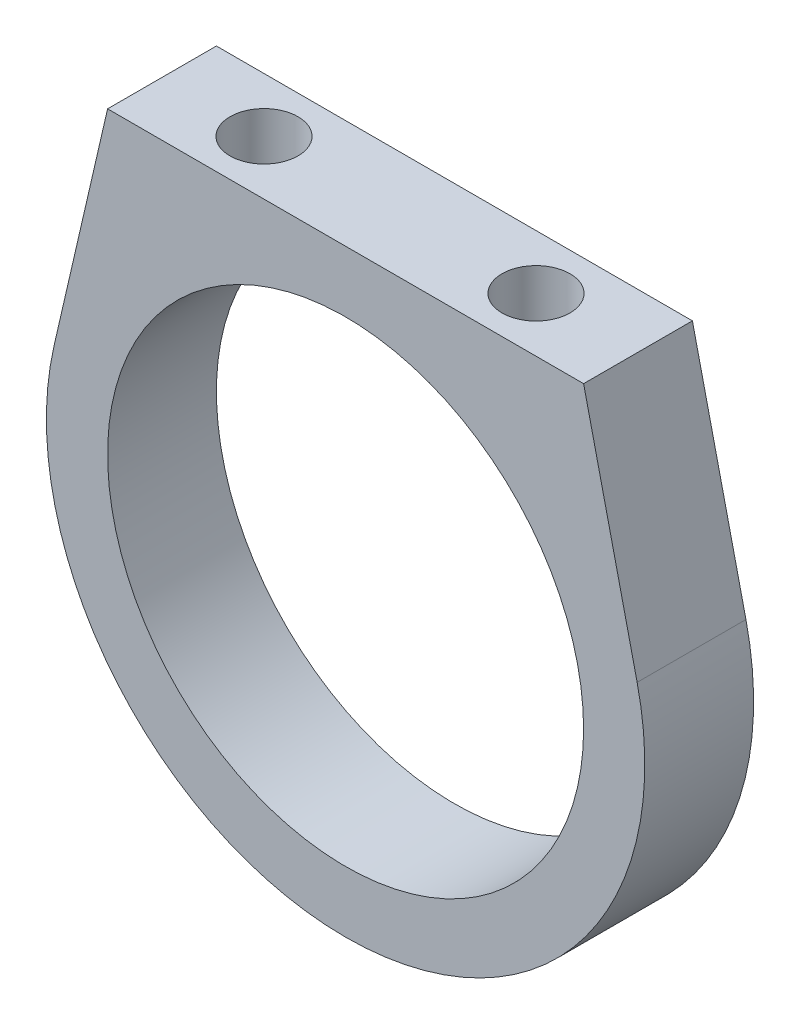
ISO-10303-21;
HEADER;
FILE_DESCRIPTION(('STEP AP214'),'2;1');
FILE_NAME('part.step','',(''),(''),'','','');
FILE_SCHEMA(('AUTOMOTIVE_DESIGN { 1 0 10303 214 1 1 1 1 }'));
ENDSEC;
DATA;
#1=APPLICATION_CONTEXT('core data for automotive mechanical design processes');
#2=APPLICATION_PROTOCOL_DEFINITION('international standard','automotive_design',2000,#1);
#3=PRODUCT_CONTEXT('',#1,'mechanical');
#4=PRODUCT('Part','Part','',(#3));
#5=PRODUCT_RELATED_PRODUCT_CATEGORY('part','',(#4));
#6=PRODUCT_DEFINITION_FORMATION('','',#4);
#7=PRODUCT_DEFINITION_CONTEXT('part definition',#1,'design');
#8=PRODUCT_DEFINITION('design','',#6,#7);
#9=PRODUCT_DEFINITION_SHAPE('','',#8);
#10=(LENGTH_UNIT() NAMED_UNIT(*) SI_UNIT(.MILLI.,.METRE.));
#11=(NAMED_UNIT(*) PLANE_ANGLE_UNIT() SI_UNIT($,.RADIAN.));
#12=(NAMED_UNIT(*) SI_UNIT($,.STERADIAN.) SOLID_ANGLE_UNIT());
#13=UNCERTAINTY_MEASURE_WITH_UNIT(LENGTH_MEASURE(1.E-05),#10,'distance_accuracy_value','');
#14=(GEOMETRIC_REPRESENTATION_CONTEXT(3) GLOBAL_UNCERTAINTY_ASSIGNED_CONTEXT((#13)) GLOBAL_UNIT_ASSIGNED_CONTEXT((#10,
#11,#12)) REPRESENTATION_CONTEXT('',''));
#15=CARTESIAN_POINT('',(0.,0.,0.));
#16=DIRECTION('',(0.,0.,1.));
#17=DIRECTION('',(1.,0.,0.));
#18=AXIS2_PLACEMENT_3D('',#15,#16,#17);
#19=CARTESIAN_POINT('',(0.,0.,2.));
#20=DIRECTION('',(0.,0.,-1.));
#21=DIRECTION('',(-1.,0.,0.));
#22=AXIS2_PLACEMENT_3D('',#19,#20,#21);
#23=PLANE('',#22);
#24=DIRECTION('',(-0.224928819993672,0.97437519772224,0.));
#25=VECTOR('',#24,1.);
#26=CARTESIAN_POINT('',(8.75,11.,2.));
#27=LINE('',#26,#25);
#28=CARTESIAN_POINT('',(10.7181271749446,2.4742170199304,2.));
#29=VERTEX_POINT('',#28);
#30=CARTESIAN_POINT('',(8.75,11.,2.));
#31=VERTEX_POINT('',#30);
#32=EDGE_CURVE('E92',#29,#31,#27,.T.);
#33=ORIENTED_EDGE('',*,*,#32,.T.);
#34=DIRECTION('',(-1.,0.,0.));
#35=VECTOR('',#34,1.);
#36=CARTESIAN_POINT('',(8.75,11.,2.));
#37=LINE('',#36,#35);
#38=CARTESIAN_POINT('',(-8.75,11.,2.));
#39=VERTEX_POINT('',#38);
#40=EDGE_CURVE('E87',#31,#39,#37,.T.);
#41=ORIENTED_EDGE('',*,*,#40,.T.);
#42=DIRECTION('',(-0.224928819993673,-0.97437519772224,0.));
#43=VECTOR('',#42,1.);
#44=CARTESIAN_POINT('',(-8.75,11.,2.));
#45=LINE('',#44,#43);
#46=CARTESIAN_POINT('',(-10.7181271749446,2.4742170199304,2.));
#47=VERTEX_POINT('',#46);
#48=EDGE_CURVE('E90',#39,#47,#45,.T.);
#49=ORIENTED_EDGE('',*,*,#48,.T.);
#50=CARTESIAN_POINT('',(0.,0.,2.));
#51=DIRECTION('',(0.,0.,1.));
#52=DIRECTION('',(-1.,0.,0.));
#53=AXIS2_PLACEMENT_3D('',#50,#51,#52);
#54=CIRCLE('',#53,11.);
#55=EDGE_CURVE('E57',#47,#29,#54,.T.);
#56=ORIENTED_EDGE('',*,*,#55,.T.);
#57=EDGE_LOOP('',(#33,#41,#49,#56));
#58=FACE_BOUND('',#57,.T.);
#59=CARTESIAN_POINT('',(0.,0.,2.));
#60=DIRECTION('',(0.,0.,1.));
#61=DIRECTION('',(1.,0.,0.));
#62=AXIS2_PLACEMENT_3D('',#59,#60,#61);
#63=CIRCLE('',#62,8.75);
#64=CARTESIAN_POINT('',(8.75,0.,2.));
#65=VERTEX_POINT('',#64);
#66=EDGE_CURVE('E112',#65,#65,#63,.T.);
#67=ORIENTED_EDGE('',*,*,#66,.F.);
#68=EDGE_LOOP('',(#67));
#69=FACE_BOUND('',#68,.T.);
#70=ADVANCED_FACE('F39',(#58,#69),#23,.F.);
#71=CARTESIAN_POINT('',(0.,0.,-2.));
#72=DIRECTION('',(0.,0.,-1.));
#73=DIRECTION('',(-1.,0.,0.));
#74=AXIS2_PLACEMENT_3D('',#71,#72,#73);
#75=PLANE('',#74);
#76=DIRECTION('',(-0.224928819993672,0.97437519772224,0.));
#77=VECTOR('',#76,1.);
#78=CARTESIAN_POINT('',(8.75,11.,-2.));
#79=LINE('',#78,#77);
#80=CARTESIAN_POINT('',(10.7181271749446,2.4742170199304,-2.));
#81=VERTEX_POINT('',#80);
#82=CARTESIAN_POINT('',(8.75,11.,-2.));
#83=VERTEX_POINT('',#82);
#84=EDGE_CURVE('E108',#81,#83,#79,.T.);
#85=ORIENTED_EDGE('',*,*,#84,.F.);
#86=CARTESIAN_POINT('',(0.,0.,-2.));
#87=DIRECTION('',(0.,0.,1.));
#88=DIRECTION('',(-1.,0.,0.));
#89=AXIS2_PLACEMENT_3D('',#86,#87,#88);
#90=CIRCLE('',#89,11.);
#91=CARTESIAN_POINT('',(-10.7181271749446,2.4742170199304,-2.));
#92=VERTEX_POINT('',#91);
#93=EDGE_CURVE('E80',#92,#81,#90,.T.);
#94=ORIENTED_EDGE('',*,*,#93,.F.);
#95=DIRECTION('',(-0.224928819993673,-0.97437519772224,0.));
#96=VECTOR('',#95,1.);
#97=CARTESIAN_POINT('',(-8.75,11.,-2.));
#98=LINE('',#97,#96);
#99=CARTESIAN_POINT('',(-8.75,11.,-2.));
#100=VERTEX_POINT('',#99);
#101=EDGE_CURVE('E74',#100,#92,#98,.T.);
#102=ORIENTED_EDGE('',*,*,#101,.F.);
#103=DIRECTION('',(-1.,0.,0.));
#104=VECTOR('',#103,1.);
#105=CARTESIAN_POINT('',(8.75,11.,-2.));
#106=LINE('',#105,#104);
#107=EDGE_CURVE('E97',#83,#100,#106,.T.);
#108=ORIENTED_EDGE('',*,*,#107,.F.);
#109=EDGE_LOOP('',(#85,#94,#102,#108));
#110=FACE_BOUND('',#109,.T.);
#111=CARTESIAN_POINT('',(0.,0.,-2.));
#112=DIRECTION('',(0.,0.,1.));
#113=DIRECTION('',(1.,0.,0.));
#114=AXIS2_PLACEMENT_3D('',#111,#112,#113);
#115=CIRCLE('',#114,8.75);
#116=CARTESIAN_POINT('',(8.75,0.,-2.));
#117=VERTEX_POINT('',#116);
#118=EDGE_CURVE('E130',#117,#117,#115,.T.);
#119=ORIENTED_EDGE('',*,*,#118,.T.);
#120=EDGE_LOOP('',(#119));
#121=FACE_BOUND('',#120,.T.);
#122=ADVANCED_FACE('F125',(#110,#121),#75,.T.);
#123=CARTESIAN_POINT('',(8.75,11.,2.));
#124=DIRECTION('',(-0.97437519772224,-0.224928819993673,0.));
#125=DIRECTION('',(0.224928819993673,-0.97437519772224,0.));
#126=AXIS2_PLACEMENT_3D('',#123,#124,#125);
#127=PLANE('',#126);
#128=ORIENTED_EDGE('',*,*,#84,.T.);
#129=DIRECTION('',(0.,0.,-1.));
#130=VECTOR('',#129,1.);
#131=CARTESIAN_POINT('',(8.75,11.,2.));
#132=LINE('',#131,#130);
#133=EDGE_CURVE('E11',#31,#83,#132,.T.);
#134=ORIENTED_EDGE('',*,*,#133,.F.);
#135=ORIENTED_EDGE('',*,*,#32,.F.);
#136=DIRECTION('',(0.,0.,-1.));
#137=VECTOR('',#136,1.);
#138=CARTESIAN_POINT('',(10.7181271749446,2.4742170199304,2.));
#139=LINE('',#138,#137);
#140=EDGE_CURVE('E104',#29,#81,#139,.T.);
#141=ORIENTED_EDGE('',*,*,#140,.T.);
#142=EDGE_LOOP('',(#128,#134,#135,#141));
#143=FACE_BOUND('',#142,.T.);
#144=ADVANCED_FACE('F41',(#143),#127,.F.);
#145=CARTESIAN_POINT('',(8.75,11.,2.));
#146=DIRECTION('',(0.,-1.,0.));
#147=DIRECTION('',(1.,0.,0.));
#148=AXIS2_PLACEMENT_3D('',#145,#146,#147);
#149=PLANE('',#148);
#150=CARTESIAN_POINT('',(-5.,11.,0.));
#151=DIRECTION('',(0.,1.,0.));
#152=DIRECTION('',(-1.,0.,0.));
#153=AXIS2_PLACEMENT_3D('',#150,#151,#152);
#154=CIRCLE('',#153,1.25);
#155=CARTESIAN_POINT('',(-6.25,11.,0.));
#156=VERTEX_POINT('',#155);
#157=EDGE_CURVE('E147',#156,#156,#154,.T.);
#158=ORIENTED_EDGE('',*,*,#157,.F.);
#159=EDGE_LOOP('',(#158));
#160=FACE_BOUND('',#159,.T.);
#161=CARTESIAN_POINT('',(5.,11.,0.));
#162=DIRECTION('',(0.,1.,0.));
#163=DIRECTION('',(-1.,0.,0.));
#164=AXIS2_PLACEMENT_3D('',#161,#162,#163);
#165=CIRCLE('',#164,1.25);
#166=CARTESIAN_POINT('',(3.75,11.,0.));
#167=VERTEX_POINT('',#166);
#168=EDGE_CURVE('E148',#167,#167,#165,.T.);
#169=ORIENTED_EDGE('',*,*,#168,.F.);
#170=EDGE_LOOP('',(#169));
#171=FACE_BOUND('',#170,.T.);
#172=ORIENTED_EDGE('',*,*,#107,.T.);
#173=DIRECTION('',(0.,0.,-1.));
#174=VECTOR('',#173,1.);
#175=CARTESIAN_POINT('',(-8.75,11.,2.));
#176=LINE('',#175,#174);
#177=EDGE_CURVE('E49',#39,#100,#176,.T.);
#178=ORIENTED_EDGE('',*,*,#177,.F.);
#179=ORIENTED_EDGE('',*,*,#40,.F.);
#180=ORIENTED_EDGE('',*,*,#133,.T.);
#181=EDGE_LOOP('',(#172,#178,#179,#180));
#182=FACE_BOUND('',#181,.T.);
#183=ADVANCED_FACE('F96',(#160,#171,#182),#149,.F.);
#184=CARTESIAN_POINT('',(-8.75,11.,2.));
#185=DIRECTION('',(0.97437519772224,-0.224928819993673,0.));
#186=DIRECTION('',(0.224928819993673,0.97437519772224,0.));
#187=AXIS2_PLACEMENT_3D('',#184,#185,#186);
#188=PLANE('',#187);
#189=ORIENTED_EDGE('',*,*,#101,.T.);
#190=DIRECTION('',(0.,0.,-1.));
#191=VECTOR('',#190,1.);
#192=CARTESIAN_POINT('',(-10.7181271749446,2.4742170199304,2.));
#193=LINE('',#192,#191);
#194=EDGE_CURVE('E99',#47,#92,#193,.T.);
#195=ORIENTED_EDGE('',*,*,#194,.F.);
#196=ORIENTED_EDGE('',*,*,#48,.F.);
#197=ORIENTED_EDGE('',*,*,#177,.T.);
#198=EDGE_LOOP('',(#189,#195,#196,#197));
#199=FACE_BOUND('',#198,.T.);
#200=ADVANCED_FACE('F100',(#199),#188,.F.);
#201=CARTESIAN_POINT('',(0.,0.,2.));
#202=DIRECTION('',(0.,0.,-1.));
#203=DIRECTION('',(-1.,0.,0.));
#204=AXIS2_PLACEMENT_3D('',#201,#202,#203);
#205=CYLINDRICAL_SURFACE('',#204,11.);
#206=ORIENTED_EDGE('',*,*,#93,.T.);
#207=ORIENTED_EDGE('',*,*,#140,.F.);
#208=ORIENTED_EDGE('',*,*,#55,.F.);
#209=ORIENTED_EDGE('',*,*,#194,.T.);
#210=EDGE_LOOP('',(#206,#207,#208,#209));
#211=FACE_BOUND('',#210,.T.);
#212=ADVANCED_FACE('F122',(#211),#205,.T.);
#213=CARTESIAN_POINT('',(0.,0.,2.));
#214=DIRECTION('',(0.,0.,-1.));
#215=DIRECTION('',(-1.,0.,0.));
#216=AXIS2_PLACEMENT_3D('',#213,#214,#215);
#217=CYLINDRICAL_SURFACE('',#216,8.75);
#218=CARTESIAN_POINT('',(-6.25,6.12372435695795,0.));
#219=CARTESIAN_POINT('',(-6.249999096093,6.12372546096745,0.0563594232897364));
#220=CARTESIAN_POINT('',(-6.24615625776132,6.1276547519167,0.112724438972845));
#221=CARTESIAN_POINT('',(-6.23113950883662,6.14292348801361,0.223438761348298));
#222=CARTESIAN_POINT('',(-6.2199592866147,6.15426931284174,0.277786290031283));
#223=CARTESIAN_POINT('',(-6.19126807045086,6.18313056019453,0.38250360300182));
#224=CARTESIAN_POINT('',(-6.17380767488917,6.20059664453786,0.432901365713372));
#225=CARTESIAN_POINT('',(-6.13355890106298,6.240413281092,0.529418482378272));
#226=CARTESIAN_POINT('',(-6.11076761360915,6.26276649988724,0.575535480956767));
#227=CARTESIAN_POINT('',(-6.04935167888696,6.32221415201453,0.683200160578885));
#228=CARTESIAN_POINT('',(-6.00824733013812,6.36138119379406,0.742188500421584));
#229=CARTESIAN_POINT('',(-5.91882511757456,6.44466983438752,0.850416866381751));
#230=CARTESIAN_POINT('',(-5.87049099603652,6.48880254269753,0.899634324644743));
#231=CARTESIAN_POINT('',(-5.75383662607383,6.59268663294137,1.00086969809913));
#232=CARTESIAN_POINT('',(-5.68369978584556,6.65336395471925,1.04984784895274));
#233=CARTESIAN_POINT('',(-5.53630902033819,6.77650582893226,1.13225629933346));
#234=CARTESIAN_POINT('',(-5.45905275709437,6.83897096379569,1.16568146942431));
#235=CARTESIAN_POINT('',(-5.2985775081916,6.96405013744927,1.21675356540498));
#236=CARTESIAN_POINT('',(-5.21531802976826,7.02666175995002,1.23427987419735));
#237=CARTESIAN_POINT('',(-5.04532512827686,7.14969891482871,1.25209603132461));
#238=CARTESIAN_POINT('',(-4.95859126934844,7.21012417110632,1.25238371025771));
#239=CARTESIAN_POINT('',(-4.78407675449362,7.32708394447044,1.23433707940384));
#240=CARTESIAN_POINT('',(-4.69629431613965,7.3836102256591,1.21596456657741));
#241=CARTESIAN_POINT('',(-4.52360067328527,7.49064728832806,1.15920623340716));
#242=CARTESIAN_POINT('',(-4.43868379749746,7.54117051963099,1.12086275346982));
#243=CARTESIAN_POINT('',(-4.30018189665139,7.62072007841812,1.03790710304831));
#244=CARTESIAN_POINT('',(-4.24466992870429,7.65172374345529,0.998365737639541));
#245=CARTESIAN_POINT('',(-4.13953717904732,7.70910537438197,0.90930649332825));
#246=CARTESIAN_POINT('',(-4.08991311700303,7.73548591989956,0.859794211401929));
#247=CARTESIAN_POINT('',(-3.99849308608598,7.78313790056994,0.751357326611252));
#248=CARTESIAN_POINT('',(-3.95673751743854,7.80438311829188,0.692386879427451));
#249=CARTESIAN_POINT('',(-3.88349497458128,7.84108761666943,0.566741516443978));
#250=CARTESIAN_POINT('',(-3.85200453177265,7.85654885200112,0.500069213446045));
#251=CARTESIAN_POINT('',(-3.80340741426022,7.88018124361184,0.367659291123228));
#252=CARTESIAN_POINT('',(-3.78523871210782,7.88889494358625,0.302406970596992));
#253=CARTESIAN_POINT('',(-3.75967743920744,7.90110949847954,0.169359179317205));
#254=CARTESIAN_POINT('',(-3.75228048670892,7.90461247303856,0.101564754163285));
#255=CARTESIAN_POINT('',(-3.74872517275212,7.90629877386604,-0.0305619194684281));
#256=CARTESIAN_POINT('',(-3.75195995121551,7.90476934445697,-0.094875170100253));
#257=CARTESIAN_POINT('',(-3.76819829012655,7.89704131252007,-0.221960516608587));
#258=CARTESIAN_POINT('',(-3.78120062463735,7.89084329595157,-0.284732804872046));
#259=CARTESIAN_POINT('',(-3.81628757543711,7.87393304627919,-0.406597214599854));
#260=CARTESIAN_POINT('',(-3.83831449081365,7.86324948208753,-0.465710019205968));
#261=CARTESIAN_POINT('',(-3.89052181118568,7.83754952383312,-0.579189716286421));
#262=CARTESIAN_POINT('',(-3.92070302837798,7.82253269815233,-0.633556135290151));
#263=CARTESIAN_POINT('',(-3.98931067867307,7.78777430605972,-0.738290308669741));
#264=CARTESIAN_POINT('',(-4.02800532699622,7.76787579959446,-0.788429680770055));
#265=CARTESIAN_POINT('',(-4.11141969746881,7.72404984811058,-0.881378919850113));
#266=CARTESIAN_POINT('',(-4.15614104306459,7.7001213170656,-0.924186804824307));
#267=CARTESIAN_POINT('',(-4.25395565342631,7.64654905937143,-1.00512197218277));
#268=CARTESIAN_POINT('',(-4.30743470910924,7.61659758234492,-1.04257760637017));
#269=CARTESIAN_POINT('',(-4.41788338739642,7.55307031514492,-1.10804696578221));
#270=CARTESIAN_POINT('',(-4.47485454094057,7.519492930384,-1.13605651433574));
#271=CARTESIAN_POINT('',(-4.59795219269701,7.44493980225258,-1.18566121300808));
#272=CARTESIAN_POINT('',(-4.66433362554407,7.40356377586208,-1.20601873825618));
#273=CARTESIAN_POINT('',(-4.79767220828918,7.31786433469221,-1.23540754246909));
#274=CARTESIAN_POINT('',(-4.86462961237544,7.27353955360786,-1.24443353193435));
#275=CARTESIAN_POINT('',(-5.0078117823398,7.17585653205728,-1.25233067311611));
#276=CARTESIAN_POINT('',(-5.08389610678853,7.12215012592676,-1.24944731648408));
#277=CARTESIAN_POINT('',(-5.23324776986433,7.01314407934382,-1.23035505007691));
#278=CARTESIAN_POINT('',(-5.30651225253695,6.95784291795123,-1.21413298418881));
#279=CARTESIAN_POINT('',(-5.4583345855297,6.83955590344397,-1.16601610076994));
#280=CARTESIAN_POINT('',(-5.53629412502829,6.77652935675438,-1.13231869093175));
#281=CARTESIAN_POINT('',(-5.68494946342322,6.65230872931585,-1.04909463472657));
#282=CARTESIAN_POINT('',(-5.75564781102282,6.59111401096962,-0.999573567782085));
#283=CARTESIAN_POINT('',(-5.87141138313349,6.48795106234658,-0.898618656743276));
#284=CARTESIAN_POINT('',(-5.91852295269155,6.44493370615744,-0.8505969918606));
#285=CARTESIAN_POINT('',(-6.00588530700094,6.36359812773176,-0.745226587313482));
#286=CARTESIAN_POINT('',(-6.04614803625173,6.32527175777461,-0.687894433968867));
#287=CARTESIAN_POINT('',(-6.10899061252573,6.26451567140223,-0.579263693283493));
#288=CARTESIAN_POINT('',(-6.13348228644272,6.24049698573919,-0.529967078675721));
#289=CARTESIAN_POINT('',(-6.17632079276237,6.19810213751813,-0.426489798287949));
#290=CARTESIAN_POINT('',(-6.19467459345415,6.17971957828762,-0.372314760288681));
#291=CARTESIAN_POINT('',(-6.22255056955986,6.1516437828712,-0.265694989849344));
#292=CARTESIAN_POINT('',(-6.23277145574091,6.14126632753066,-0.213617367915958));
#293=CARTESIAN_POINT('',(-6.24649435745652,6.12730835856435,-0.107694061635097));
#294=CARTESIAN_POINT('',(-6.25000086365354,6.12372330211302,-0.0538495835149319));
#295=CARTESIAN_POINT('',(-6.25,6.12372435695795,0.));
#296=B_SPLINE_CURVE_WITH_KNOTS('',3,(#218,#219,#220,#221,#222,#223,#224,#225,#226,#227,#228,
#229,#230,#231,#232,#233,#234,#235,#236,#237,#238,#239,#240,#241,#242,#243,#244,#245,#246,#247,
#248,#249,#250,#251,#252,#253,#254,#255,#256,#257,#258,#259,#260,#261,#262,#263,#264,#265,#266,
#267,#268,#269,#270,#271,#272,#273,#274,#275,#276,#277,#278,#279,#280,#281,#282,#283,#284,#285,
#286,#287,#288,#289,#290,#291,#292,#293,#294,#295),.UNSPECIFIED.,.T.,.F.,(4,2,2,2,2,2,2,2,2,2,2,
2,2,2,2,2,2,2,2,2,2,2,2,2,2,2,2,2,2,2,2,2,2,2,2,2,2,2,4),(0.,0.168836841294259,
0.337819106995227,0.505469333568072,0.673211265039158,0.917483490871702,1.16231351215936,
1.47535131733696,1.7884922906063,2.10398951677298,2.41952644672235,2.73571068067113,
3.05122728539251,3.27493240050976,3.49851229147229,3.72321059643704,3.9478328966709,
4.15165219023416,4.35538855065847,4.54770205632058,4.739991428532,4.93107007492327,
5.12216776043286,5.32047837280405,5.51884251243527,5.73347248720492,5.94819723849085,
6.18973338168172,6.43138223076559,6.70980734594098,6.98850740468303,7.30439902288818,
7.62017938037068,7.85894354021995,8.09728692410481,8.27681849191477,8.45614554118431,
8.61757161619797,8.77888968964476),.UNSPECIFIED.);
#297=CARTESIAN_POINT('',(-6.25,6.12372435695795,0.));
#298=VERTEX_POINT('',#297);
#299=EDGE_CURVE('E134',#298,#298,#296,.T.);
#300=ORIENTED_EDGE('',*,*,#299,.T.);
#301=EDGE_LOOP('',(#300));
#302=FACE_BOUND('',#301,.T.);
#303=CARTESIAN_POINT('',(3.75,7.90569415042095,0.));
#304=CARTESIAN_POINT('',(3.74999809120613,7.90569475984926,0.0648369336644717));
#305=CARTESIAN_POINT('',(3.75506264894734,7.90329859528061,0.129662461540309));
#306=CARTESIAN_POINT('',(3.77508207414912,7.89375557503793,0.257396851394431));
#307=CARTESIAN_POINT('',(3.79003537265199,7.88660947299291,0.320306015768854));
#308=CARTESIAN_POINT('',(3.82913492417158,7.86769927103687,0.442353756588024));
#309=CARTESIAN_POINT('',(3.85326856200871,7.85594150756232,0.501497377845105));
#310=CARTESIAN_POINT('',(3.90969925235225,7.82800986708873,0.614606112357862));
#311=CARTESIAN_POINT('',(3.9419971981138,7.81183550685526,0.668570658080103));
#312=CARTESIAN_POINT('',(4.01450942196592,7.77482556641719,0.771616148461278));
#313=CARTESIAN_POINT('',(4.05492534675535,7.75386888433481,0.820511096567606));
#314=CARTESIAN_POINT('',(4.1415128307233,7.70796804421446,0.910721052639545));
#315=CARTESIAN_POINT('',(4.18768582719155,7.68302288998828,0.95203416136146));
#316=CARTESIAN_POINT('',(4.28848593223916,7.62725255642312,1.02987799594353));
#317=CARTESIAN_POINT('',(4.34349922823068,7.59610400320169,1.06567508371819));
#318=CARTESIAN_POINT('',(4.45671330264293,7.53023922369757,1.12761241108793));
#319=CARTESIAN_POINT('',(4.51491556817923,7.49552132619019,1.153748100499));
#320=CARTESIAN_POINT('',(4.64056133000643,7.41847612371931,1.19930228039964));
#321=CARTESIAN_POINT('',(4.70822806618738,7.37574502397722,1.21741854782892));
#322=CARTESIAN_POINT('',(4.84378456092978,7.28744203700736,1.24211541629241));
#323=CARTESIAN_POINT('',(4.91167440609393,7.24186888102624,1.24869082651599));
#324=CARTESIAN_POINT('',(5.05656868532953,7.14160367056954,1.25112869049803));
#325=CARTESIAN_POINT('',(5.13337715353988,7.08658377030506,1.24519675881163));
#326=CARTESIAN_POINT('',(5.28376080409313,6.97518129738583,1.21975677879568));
#327=CARTESIAN_POINT('',(5.35733225181518,6.91879726137246,1.20023346498769));
#328=CARTESIAN_POINT('',(5.5088228089497,6.79895776034703,1.14494638406821));
#329=CARTESIAN_POINT('',(5.58611732738579,6.73550865079296,1.10744278881249));
#330=CARTESIAN_POINT('',(5.73283805780976,6.61107327229668,1.01631724840229));
#331=CARTESIAN_POINT('',(5.80227025840159,6.5500851519616,0.962707686174052));
#332=CARTESIAN_POINT('',(5.91240424790854,6.45056827140979,0.856780952983632));
#333=CARTESIAN_POINT('',(5.95565180177359,6.41059549696147,0.808457357732974));
#334=CARTESIAN_POINT('',(6.03548320352507,6.33548944508499,0.703290449698679));
#335=CARTESIAN_POINT('',(6.07207895349791,6.30034755177553,0.64646269248362));
#336=CARTESIAN_POINT('',(6.12924907289681,6.24467923604106,0.538616137351566));
#337=CARTESIAN_POINT('',(6.15157079282216,6.22265328991607,0.489305777186777));
#338=CARTESIAN_POINT('',(6.19010248686539,6.18432461204389,0.386231921630041));
#339=CARTESIAN_POINT('',(6.20631695672807,6.16801767096314,0.332471737597849));
#340=CARTESIAN_POINT('',(6.23162971273768,6.14244466129556,0.221077003182804));
#341=CARTESIAN_POINT('',(6.24066041960015,6.1332454796325,0.16341107231151));
#342=CARTESIAN_POINT('',(6.25049672332947,6.12322192408601,0.046674875157099));
#343=CARTESIAN_POINT('',(6.2513097689625,6.12238996587153,-0.0123940706864803));
#344=CARTESIAN_POINT('',(6.24513284825759,6.12868856891104,-0.121176112522756));
#345=CARTESIAN_POINT('',(6.23923671870217,6.13470297982072,-0.171024508904894));
#346=CARTESIAN_POINT('',(6.22179251985735,6.15239392376377,-0.268674352958908));
#347=CARTESIAN_POINT('',(6.21024195398842,6.16407295785342,-0.316474886298601));
#348=CARTESIAN_POINT('',(6.17840055811705,6.19600642379897,-0.42146412666991));
#349=CARTESIAN_POINT('',(6.15659885001276,6.21771849645985,-0.477747701371195));
#350=CARTESIAN_POINT('',(6.10646901970534,6.2669587692524,-0.584572340203386));
#351=CARTESIAN_POINT('',(6.07812860350913,6.29449791718486,-0.63510231579026));
#352=CARTESIAN_POINT('',(6.00533618008887,6.36409969671265,-0.746769410909766));
#353=CARTESIAN_POINT('',(5.95871793590924,6.40787057540431,-0.805421685980153));
#354=CARTESIAN_POINT('',(5.8581731421876,6.49992107487642,-0.91181645472906));
#355=CARTESIAN_POINT('',(5.8042389886511,6.54820537035059,-0.959547456518917));
#356=CARTESIAN_POINT('',(5.68912861567535,6.64847999531737,-1.04541045178787));
#357=CARTESIAN_POINT('',(5.62780277111834,6.7005334382148,-1.08326657152205));
#358=CARTESIAN_POINT('',(5.5002872400083,6.80559897314442,-1.14774506620006));
#359=CARTESIAN_POINT('',(5.4340965841359,6.85861125463128,-1.17436519519586));
#360=CARTESIAN_POINT('',(5.28395904952118,6.9751729756639,-1.22033899684369));
#361=CARTESIAN_POINT('',(5.19915022168461,7.03865897505539,-1.23709129850174));
#362=CARTESIAN_POINT('',(5.02614049115736,7.16322223311157,-1.25273683033062));
#363=CARTESIAN_POINT('',(4.93794074983064,7.22430030221225,-1.25163612161907));
#364=CARTESIAN_POINT('',(4.77616776241101,7.332018593341,-1.23201043832123));
#365=CARTESIAN_POINT('',(4.70268124269229,7.37933803858633,-1.21650725836971));
#366=CARTESIAN_POINT('',(4.5574529766051,7.46990147915095,-1.17150418082485));
#367=CARTESIAN_POINT('',(4.48571047688528,7.5131472582144,-1.14201044377186));
#368=CARTESIAN_POINT('',(4.34617453086576,7.59472511385072,-1.06830801200164));
#369=CARTESIAN_POINT('',(4.27841502254488,7.63301759021301,-1.02398980665658));
#370=CARTESIAN_POINT('',(4.1508847292625,7.70311313842837,-0.920978257017542));
#371=CARTESIAN_POINT('',(4.09110713655142,7.73492175269944,-0.862297285288955));
#372=CARTESIAN_POINT('',(3.99069303921549,7.78714544197529,-0.741025384814806));
#373=CARTESIAN_POINT('',(3.94855301963662,7.80852750743921,-0.680094983932751));
#374=CARTESIAN_POINT('',(3.87519738063293,7.84519184892848,-0.550326772426761));
#375=CARTESIAN_POINT('',(3.84397371769033,7.86047861733369,-0.481494833794362));
#376=CARTESIAN_POINT('',(3.79647757225407,7.88352053251495,-0.344685411717993));
#377=CARTESIAN_POINT('',(3.77912448550295,7.89182351002006,-0.277173798255632));
#378=CARTESIAN_POINT('',(3.75588908195403,7.90290885765105,-0.139769714274872));
#379=CARTESIAN_POINT('',(3.7500020572093,7.90569349360745,-0.0698782329255359));
#380=CARTESIAN_POINT('',(3.75,7.90569415042095,0.));
#381=B_SPLINE_CURVE_WITH_KNOTS('',3,(#303,#304,#305,#306,#307,#308,#309,#310,#311,#312,#313,
#314,#315,#316,#317,#318,#319,#320,#321,#322,#323,#324,#325,#326,#327,#328,#329,#330,#331,#332,
#333,#334,#335,#336,#337,#338,#339,#340,#341,#342,#343,#344,#345,#346,#347,#348,#349,#350,#351,
#352,#353,#354,#355,#356,#357,#358,#359,#360,#361,#362,#363,#364,#365,#366,#367,#368,#369,#370,
#371,#372,#373,#374,#375,#376,#377,#378,#379,#380),.UNSPECIFIED.,.T.,.F.,(4,2,2,2,2,2,2,2,2,2,2,
2,2,2,2,2,2,2,2,2,2,2,2,2,2,2,2,2,2,2,2,2,2,2,2,2,2,2,4),(0.,0.194253084893786,
0.388475356787034,0.582431696323577,0.776409265772586,0.975987665696335,1.17561599178579,
1.39269311243159,1.60987233902225,1.85508027597973,2.10039847356013,2.3832769451072,
2.66647365190645,2.9854403250735,3.30416238848605,3.5319673412339,3.75936058098727,
3.93402714490506,4.10856487863523,4.28472572826235,4.46072688539942,4.61168466373455,
4.76270915402057,4.95409573522149,5.14584513444489,5.404764264186,5.663954600828,
5.9297556253756,6.1956097554224,6.51586209893951,6.83600571869268,7.10122386963495,
7.3663253438395,7.63343007894184,7.90030552597537,8.13030661122664,8.36013786543599,
8.56958082487393,8.77893776921922),.UNSPECIFIED.);
#382=CARTESIAN_POINT('',(3.75,7.90569415042095,0.));
#383=VERTEX_POINT('',#382);
#384=EDGE_CURVE('E138',#383,#383,#381,.T.);
#385=ORIENTED_EDGE('',*,*,#384,.T.);
#386=EDGE_LOOP('',(#385));
#387=FACE_BOUND('',#386,.T.);
#388=ORIENTED_EDGE('',*,*,#66,.T.);
#389=EDGE_LOOP('',(#388));
#390=FACE_BOUND('',#389,.T.);
#391=ORIENTED_EDGE('',*,*,#118,.F.);
#392=EDGE_LOOP('',(#391));
#393=FACE_BOUND('',#392,.T.);
#394=ADVANCED_FACE('F180',(#302,#387,#390,#393),#217,.F.);
#395=CARTESIAN_POINT('',(5.,-11.001,0.));
#396=DIRECTION('',(0.,1.,0.));
#397=DIRECTION('',(-1.,0.,0.));
#398=AXIS2_PLACEMENT_3D('',#395,#396,#397);
#399=CYLINDRICAL_SURFACE('',#398,1.25);
#400=ORIENTED_EDGE('',*,*,#168,.T.);
#401=EDGE_LOOP('',(#400));
#402=FACE_BOUND('',#401,.T.);
#403=ORIENTED_EDGE('',*,*,#384,.F.);
#404=EDGE_LOOP('',(#403));
#405=FACE_BOUND('',#404,.T.);
#406=ADVANCED_FACE('F150',(#402,#405),#399,.F.);
#407=CARTESIAN_POINT('',(-5.,-11.001,0.));
#408=DIRECTION('',(0.,1.,0.));
#409=DIRECTION('',(-1.,0.,0.));
#410=AXIS2_PLACEMENT_3D('',#407,#408,#409);
#411=CYLINDRICAL_SURFACE('',#410,1.25);
#412=ORIENTED_EDGE('',*,*,#157,.T.);
#413=EDGE_LOOP('',(#412));
#414=FACE_BOUND('',#413,.T.);
#415=ORIENTED_EDGE('',*,*,#299,.F.);
#416=EDGE_LOOP('',(#415));
#417=FACE_BOUND('',#416,.T.);
#418=ADVANCED_FACE('F155',(#414,#417),#411,.F.);
#419=CLOSED_SHELL('',(#70,#122,#144,#183,#200,#212,#394,#406,#418));
#420=MANIFOLD_SOLID_BREP('B2',#419);
#421=ADVANCED_BREP_SHAPE_REPRESENTATION('',(#18,#420),#14);
#422=SHAPE_DEFINITION_REPRESENTATION(#9,#421);
ENDSEC;
END-ISO-10303-21;
